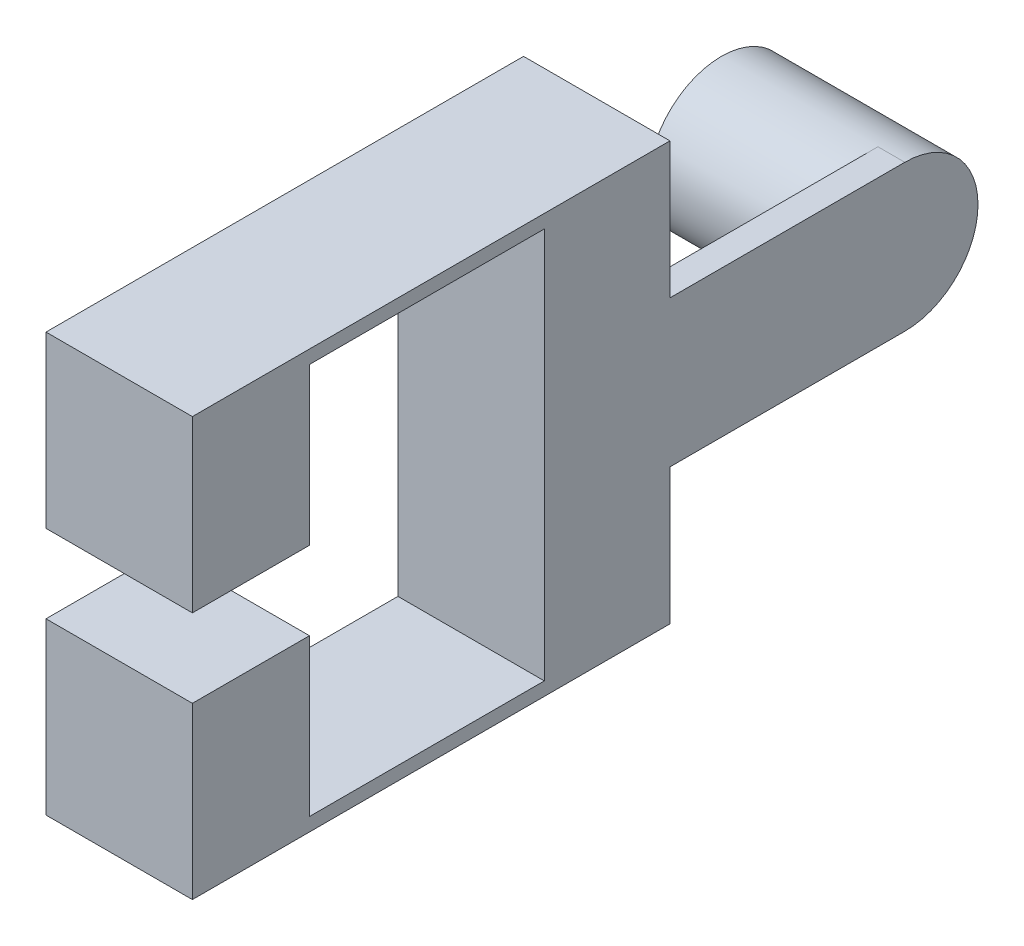
ISO-10303-21;
HEADER;
FILE_DESCRIPTION(('STEP AP214'),'2;1');
FILE_NAME('part.step','',(''),(''),'','','');
FILE_SCHEMA(('AUTOMOTIVE_DESIGN { 1 0 10303 214 1 1 1 1 }'));
ENDSEC;
DATA;
#1=APPLICATION_CONTEXT('core data for automotive mechanical design processes');
#2=APPLICATION_PROTOCOL_DEFINITION('international standard','automotive_design',2000,#1);
#3=PRODUCT_CONTEXT('',#1,'mechanical');
#4=PRODUCT('Part','Part','',(#3));
#5=PRODUCT_RELATED_PRODUCT_CATEGORY('part','',(#4));
#6=PRODUCT_DEFINITION_FORMATION('','',#4);
#7=PRODUCT_DEFINITION_CONTEXT('part definition',#1,'design');
#8=PRODUCT_DEFINITION('design','',#6,#7);
#9=PRODUCT_DEFINITION_SHAPE('','',#8);
#10=(LENGTH_UNIT() NAMED_UNIT(*) SI_UNIT(.MILLI.,.METRE.));
#11=(NAMED_UNIT(*) PLANE_ANGLE_UNIT() SI_UNIT($,.RADIAN.));
#12=(NAMED_UNIT(*) SI_UNIT($,.STERADIAN.) SOLID_ANGLE_UNIT());
#13=UNCERTAINTY_MEASURE_WITH_UNIT(LENGTH_MEASURE(1.E-05),#10,'distance_accuracy_value','');
#14=(GEOMETRIC_REPRESENTATION_CONTEXT(3) GLOBAL_UNCERTAINTY_ASSIGNED_CONTEXT((#13)) GLOBAL_UNIT_ASSIGNED_CONTEXT((#10,
#11,#12)) REPRESENTATION_CONTEXT('',''));
#15=CARTESIAN_POINT('',(0.,0.,0.));
#16=DIRECTION('',(0.,0.,1.));
#17=DIRECTION('',(1.,0.,0.));
#18=AXIS2_PLACEMENT_3D('',#15,#16,#17);
#19=CARTESIAN_POINT('',(25.4,0.,0.));
#20=DIRECTION('',(-1.,0.,0.));
#21=DIRECTION('',(0.,0.,1.));
#22=AXIS2_PLACEMENT_3D('',#19,#20,#21);
#23=CYLINDRICAL_SURFACE('',#22,11.8736401687946);
#24=CARTESIAN_POINT('',(25.4,0.,0.));
#25=DIRECTION('',(1.,0.,0.));
#26=DIRECTION('',(0.,0.,-1.));
#27=AXIS2_PLACEMENT_3D('',#24,#25,#26);
#28=CIRCLE('',#27,11.8736401687946);
#29=CARTESIAN_POINT('',(25.4,11.8736401687946,0.));
#30=VERTEX_POINT('',#29);
#31=CARTESIAN_POINT('',(25.4,-11.8736401687946,0.));
#32=VERTEX_POINT('',#31);
#33=EDGE_CURVE('E11',#30,#32,#28,.T.);
#34=ORIENTED_EDGE('',*,*,#33,.F.);
#35=DIRECTION('',(-1.,0.,0.));
#36=VECTOR('',#35,1.);
#37=CARTESIAN_POINT('',(29.7593720128164,11.8736401687946,0.));
#38=LINE('',#37,#36);
#39=CARTESIAN_POINT('',(29.7593720128164,11.8736401687946,0.));
#40=VERTEX_POINT('',#39);
#41=EDGE_CURVE('E324',#40,#30,#38,.T.);
#42=ORIENTED_EDGE('',*,*,#41,.F.);
#43=CARTESIAN_POINT('',(29.7593720128164,0.,0.));
#44=DIRECTION('',(1.,0.,0.));
#45=DIRECTION('',(0.,0.,1.));
#46=AXIS2_PLACEMENT_3D('',#43,#44,#45);
#47=CIRCLE('',#46,11.8736401687946);
#48=CARTESIAN_POINT('',(29.7593720128164,-11.8736401687946,-1.31617191178365E-06));
#49=VERTEX_POINT('',#48);
#50=EDGE_CURVE('E297',#49,#40,#47,.T.);
#51=ORIENTED_EDGE('',*,*,#50,.F.);
#52=DIRECTION('',(-1.,0.,0.));
#53=VECTOR('',#52,1.);
#54=CARTESIAN_POINT('',(29.7593720128164,-11.8736401687946,-1.31617191178365E-06));
#55=LINE('',#54,#53);
#56=EDGE_CURVE('E305',#49,#32,#55,.T.);
#57=ORIENTED_EDGE('',*,*,#56,.T.);
#58=EDGE_LOOP('',(#34,#42,#51,#57));
#59=FACE_BOUND('',#58,.T.);
#60=CARTESIAN_POINT('',(0.,0.,0.));
#61=DIRECTION('',(1.,0.,0.));
#62=DIRECTION('',(0.,0.,-1.));
#63=AXIS2_PLACEMENT_3D('',#60,#61,#62);
#64=CIRCLE('',#63,11.8736401687946);
#65=CARTESIAN_POINT('',(0.,0.,-11.8736401687946));
#66=VERTEX_POINT('',#65);
#67=EDGE_CURVE('E48',#66,#66,#64,.T.);
#68=ORIENTED_EDGE('',*,*,#67,.T.);
#69=EDGE_LOOP('',(#68));
#70=FACE_BOUND('',#69,.T.);
#71=ADVANCED_FACE('F45',(#59,#70),#23,.T.);
#72=CARTESIAN_POINT('',(0.,0.,0.));
#73=DIRECTION('',(1.,0.,0.));
#74=DIRECTION('',(0.,0.,-1.));
#75=AXIS2_PLACEMENT_3D('',#72,#73,#74);
#76=PLANE('',#75);
#77=ORIENTED_EDGE('',*,*,#67,.F.);
#78=EDGE_LOOP('',(#77));
#79=FACE_BOUND('',#78,.T.);
#80=ADVANCED_FACE('F332',(#79),#76,.F.);
#81=CARTESIAN_POINT('',(29.7593720128164,11.8736401687946,0.));
#82=DIRECTION('',(0.,-1.,0.));
#83=DIRECTION('',(0.,0.,-1.));
#84=AXIS2_PLACEMENT_3D('',#81,#82,#83);
#85=PLANE('',#84);
#86=DIRECTION('',(0.,0.,1.));
#87=VECTOR('',#86,1.);
#88=CARTESIAN_POINT('',(25.4,11.8736401687946,0.));
#89=LINE('',#88,#87);
#90=CARTESIAN_POINT('',(25.4,11.8736401687946,38.0999986838281));
#91=VERTEX_POINT('',#90);
#92=EDGE_CURVE('E291',#30,#91,#89,.T.);
#93=ORIENTED_EDGE('',*,*,#92,.T.);
#94=DIRECTION('',(-1.,0.,0.));
#95=VECTOR('',#94,1.);
#96=CARTESIAN_POINT('',(29.7593720128164,11.8736401687946,38.0999986838281));
#97=LINE('',#96,#95);
#98=CARTESIAN_POINT('',(29.7593720128164,11.8736401687946,38.0999986838281));
#99=VERTEX_POINT('',#98);
#100=EDGE_CURVE('E320',#99,#91,#97,.T.);
#101=ORIENTED_EDGE('',*,*,#100,.F.);
#102=DIRECTION('',(0.,0.,1.));
#103=VECTOR('',#102,1.);
#104=CARTESIAN_POINT('',(29.7593720128164,11.8736401687946,0.));
#105=LINE('',#104,#103);
#106=EDGE_CURVE('E87',#40,#99,#105,.T.);
#107=ORIENTED_EDGE('',*,*,#106,.F.);
#108=ORIENTED_EDGE('',*,*,#41,.T.);
#109=EDGE_LOOP('',(#93,#101,#107,#108));
#110=FACE_BOUND('',#109,.T.);
#111=ADVANCED_FACE('F334',(#110),#85,.F.);
#112=CARTESIAN_POINT('',(29.7593720128164,-11.8736401687946,-1.31617191178365E-06));
#113=DIRECTION('',(0.,1.,0.));
#114=DIRECTION('',(0.,0.,1.));
#115=AXIS2_PLACEMENT_3D('',#112,#113,#114);
#116=PLANE('',#115);
#117=DIRECTION('',(0.,0.,-1.));
#118=VECTOR('',#117,1.);
#119=CARTESIAN_POINT('',(25.4,-11.8736401687946,-1.31617191178365E-06));
#120=LINE('',#119,#118);
#121=CARTESIAN_POINT('',(25.4,-11.8736401687946,38.0999986838281));
#122=VERTEX_POINT('',#121);
#123=EDGE_CURVE('E300',#122,#32,#120,.T.);
#124=ORIENTED_EDGE('',*,*,#123,.T.);
#125=ORIENTED_EDGE('',*,*,#56,.F.);
#126=DIRECTION('',(0.,0.,-1.));
#127=VECTOR('',#126,1.);
#128=CARTESIAN_POINT('',(29.7593720128164,-11.8736401687946,-1.31617191178365E-06));
#129=LINE('',#128,#127);
#130=CARTESIAN_POINT('',(29.7593720128164,-11.8736401687946,38.0999986838281));
#131=VERTEX_POINT('',#130);
#132=EDGE_CURVE('E67',#131,#49,#129,.T.);
#133=ORIENTED_EDGE('',*,*,#132,.F.);
#134=DIRECTION('',(-1.,0.,0.));
#135=VECTOR('',#134,1.);
#136=CARTESIAN_POINT('',(29.7593720128164,-11.8736401687946,38.0999986838281));
#137=LINE('',#136,#135);
#138=EDGE_CURVE('E80',#131,#122,#137,.T.);
#139=ORIENTED_EDGE('',*,*,#138,.T.);
#140=EDGE_LOOP('',(#124,#125,#133,#139));
#141=FACE_BOUND('',#140,.T.);
#142=ADVANCED_FACE('F339',(#141),#116,.F.);
#143=CARTESIAN_POINT('',(29.7593720128164,0.,0.));
#144=DIRECTION('',(-1.,0.,0.));
#145=DIRECTION('',(0.,0.,1.));
#146=AXIS2_PLACEMENT_3D('',#143,#144,#145);
#147=PLANE('',#146);
#148=ORIENTED_EDGE('',*,*,#50,.T.);
#149=ORIENTED_EDGE('',*,*,#106,.T.);
#150=DIRECTION('',(0.,1.,0.));
#151=VECTOR('',#150,1.);
#152=CARTESIAN_POINT('',(29.7593720128164,31.75,38.0999986838281));
#153=LINE('',#152,#151);
#154=CARTESIAN_POINT('',(29.7593720128164,33.9296860064082,38.0999986838281));
#155=VERTEX_POINT('',#154);
#156=EDGE_CURVE('E294',#99,#155,#153,.T.);
#157=ORIENTED_EDGE('',*,*,#156,.T.);
#158=DIRECTION('',(0.,0.,1.));
#159=VECTOR('',#158,1.);
#160=CARTESIAN_POINT('',(29.7593720128164,33.9296860064082,38.0999986838281));
#161=LINE('',#160,#159);
#162=CARTESIAN_POINT('',(29.7593720128164,33.9296860064082,115.569045481264));
#163=VERTEX_POINT('',#162);
#164=EDGE_CURVE('E254',#155,#163,#161,.T.);
#165=ORIENTED_EDGE('',*,*,#164,.T.);
#166=DIRECTION('',(0.,1.,0.));
#167=VECTOR('',#166,1.);
#168=CARTESIAN_POINT('',(29.7593720128164,33.9296860064082,115.569045481264));
#169=LINE('',#168,#167);
#170=CARTESIAN_POINT('',(29.7593720128164,6.34999999999999,115.569045481264));
#171=VERTEX_POINT('',#170);
#172=EDGE_CURVE('E176',#171,#163,#169,.T.);
#173=ORIENTED_EDGE('',*,*,#172,.F.);
#174=DIRECTION('',(0.,0.,-1.));
#175=VECTOR('',#174,1.);
#176=CARTESIAN_POINT('',(29.7593720128164,6.34999999999999,115.569045481264));
#177=LINE('',#176,#175);
#178=CARTESIAN_POINT('',(29.7593720128164,6.34999999999999,96.577196337597));
#179=VERTEX_POINT('',#178);
#180=EDGE_CURVE('E171',#171,#179,#177,.T.);
#181=ORIENTED_EDGE('',*,*,#180,.T.);
#182=DIRECTION('',(0.,1.,0.));
#183=VECTOR('',#182,1.);
#184=CARTESIAN_POINT('',(29.7593720128164,33.9296860064082,96.577196337597));
#185=LINE('',#184,#183);
#186=CARTESIAN_POINT('',(29.7593720128164,31.75,96.577196337597));
#187=VERTEX_POINT('',#186);
#188=EDGE_CURVE('E187',#179,#187,#185,.T.);
#189=ORIENTED_EDGE('',*,*,#188,.T.);
#190=DIRECTION('',(0.,0.,1.));
#191=VECTOR('',#190,1.);
#192=CARTESIAN_POINT('',(29.7593720128164,31.75,38.0999986838281));
#193=LINE('',#192,#191);
#194=CARTESIAN_POINT('',(29.7593720128164,31.75,58.477196337597));
#195=VERTEX_POINT('',#194);
#196=EDGE_CURVE('E246',#195,#187,#193,.T.);
#197=ORIENTED_EDGE('',*,*,#196,.F.);
#198=DIRECTION('',(0.,1.,0.));
#199=VECTOR('',#198,1.);
#200=CARTESIAN_POINT('',(29.7593720128164,31.75,58.477196337597));
#201=LINE('',#200,#199);
#202=CARTESIAN_POINT('',(29.7593720128164,-31.75,58.477196337597));
#203=VERTEX_POINT('',#202);
#204=EDGE_CURVE('E283',#203,#195,#201,.T.);
#205=ORIENTED_EDGE('',*,*,#204,.F.);
#206=DIRECTION('',(0.,0.,1.));
#207=VECTOR('',#206,1.);
#208=CARTESIAN_POINT('',(29.7593720128164,-31.75,38.0999986838281));
#209=LINE('',#208,#207);
#210=CARTESIAN_POINT('',(29.7593720128164,-31.75,96.577196337597));
#211=VERTEX_POINT('',#210);
#212=EDGE_CURVE('E194',#203,#211,#209,.T.);
#213=ORIENTED_EDGE('',*,*,#212,.T.);
#214=DIRECTION('',(0.,1.,0.));
#215=VECTOR('',#214,1.);
#216=CARTESIAN_POINT('',(29.7593720128164,-33.9296860064082,96.577196337597));
#217=LINE('',#216,#215);
#218=CARTESIAN_POINT('',(29.7593720128164,-6.34999999999998,96.577196337597));
#219=VERTEX_POINT('',#218);
#220=EDGE_CURVE('E215',#211,#219,#217,.T.);
#221=ORIENTED_EDGE('',*,*,#220,.T.);
#222=DIRECTION('',(0.,0.,-1.));
#223=VECTOR('',#222,1.);
#224=CARTESIAN_POINT('',(29.7593720128164,-6.34999999999998,115.569045481264));
#225=LINE('',#224,#223);
#226=CARTESIAN_POINT('',(29.7593720128164,-6.34999999999998,115.569045481264));
#227=VERTEX_POINT('',#226);
#228=EDGE_CURVE('E203',#227,#219,#225,.T.);
#229=ORIENTED_EDGE('',*,*,#228,.F.);
#230=DIRECTION('',(0.,1.,0.));
#231=VECTOR('',#230,1.);
#232=CARTESIAN_POINT('',(29.7593720128164,-33.9296860064082,115.569045481264));
#233=LINE('',#232,#231);
#234=CARTESIAN_POINT('',(29.7593720128164,-33.9296860064082,115.569045481264));
#235=VERTEX_POINT('',#234);
#236=EDGE_CURVE('E225',#235,#227,#233,.T.);
#237=ORIENTED_EDGE('',*,*,#236,.F.);
#238=DIRECTION('',(0.,0.,1.));
#239=VECTOR('',#238,1.);
#240=CARTESIAN_POINT('',(29.7593720128164,-33.9296860064082,38.0999986838281));
#241=LINE('',#240,#239);
#242=CARTESIAN_POINT('',(29.7593720128164,-33.9296860064082,38.0999986838281));
#243=VERTEX_POINT('',#242);
#244=EDGE_CURVE('E235',#243,#235,#241,.T.);
#245=ORIENTED_EDGE('',*,*,#244,.F.);
#246=EDGE_CURVE('E279',#243,#131,#153,.T.);
#247=ORIENTED_EDGE('',*,*,#246,.T.);
#248=ORIENTED_EDGE('',*,*,#132,.T.);
#249=EDGE_LOOP('',(#148,#149,#157,#165,#173,#181,#189,#197,#205,#213,#221,#229,#237,#245,#247,#248));
#250=FACE_BOUND('',#249,.T.);
#251=ADVANCED_FACE('F345',(#250),#147,.F.);
#252=CARTESIAN_POINT('',(25.4,0.,0.));
#253=DIRECTION('',(-1.,0.,0.));
#254=DIRECTION('',(0.,0.,1.));
#255=AXIS2_PLACEMENT_3D('',#252,#253,#254);
#256=PLANE('',#255);
#257=ORIENTED_EDGE('',*,*,#92,.F.);
#258=ORIENTED_EDGE('',*,*,#33,.T.);
#259=ORIENTED_EDGE('',*,*,#123,.F.);
#260=DIRECTION('',(0.,-1.,0.));
#261=VECTOR('',#260,1.);
#262=CARTESIAN_POINT('',(25.4,-11.8736401687946,38.0999986838281));
#263=LINE('',#262,#261);
#264=EDGE_CURVE('E309',#91,#122,#263,.T.);
#265=ORIENTED_EDGE('',*,*,#264,.F.);
#266=EDGE_LOOP('',(#257,#258,#259,#265));
#267=FACE_BOUND('',#266,.T.);
#268=ADVANCED_FACE('F346',(#267),#256,.T.);
#269=CARTESIAN_POINT('',(6.01209167522726,31.75,58.477196337597));
#270=DIRECTION('',(1.,0.,0.));
#271=DIRECTION('',(0.,1.,0.));
#272=AXIS2_PLACEMENT_3D('',#269,#270,#271);
#273=PLANE('',#272);
#274=DIRECTION('',(0.,-1.,0.));
#275=VECTOR('',#274,1.);
#276=CARTESIAN_POINT('',(6.01209167522726,31.75,38.0999986838281));
#277=LINE('',#276,#275);
#278=CARTESIAN_POINT('',(6.01209167522726,33.9296860064082,38.0999986838281));
#279=VERTEX_POINT('',#278);
#280=CARTESIAN_POINT('',(6.01209167522727,-33.9296860064082,38.0999986838281));
#281=VERTEX_POINT('',#280);
#282=EDGE_CURVE('E265',#279,#281,#277,.T.);
#283=ORIENTED_EDGE('',*,*,#282,.T.);
#284=DIRECTION('',(0.,0.,-1.));
#285=VECTOR('',#284,1.);
#286=CARTESIAN_POINT('',(6.01209167522727,-33.9296860064082,38.0999986838281));
#287=LINE('',#286,#285);
#288=CARTESIAN_POINT('',(6.01209167522727,-33.9296860064082,115.569045481264));
#289=VERTEX_POINT('',#288);
#290=EDGE_CURVE('E238',#289,#281,#287,.T.);
#291=ORIENTED_EDGE('',*,*,#290,.F.);
#292=DIRECTION('',(0.,-1.,0.));
#293=VECTOR('',#292,1.);
#294=CARTESIAN_POINT('',(6.01209167522727,-33.9296860064082,115.569045481264));
#295=LINE('',#294,#293);
#296=CARTESIAN_POINT('',(6.01209167522726,-6.34999999999998,115.569045481264));
#297=VERTEX_POINT('',#296);
#298=EDGE_CURVE('E216',#297,#289,#295,.T.);
#299=ORIENTED_EDGE('',*,*,#298,.F.);
#300=DIRECTION('',(0.,0.,-1.));
#301=VECTOR('',#300,1.);
#302=CARTESIAN_POINT('',(6.01209167522726,-6.34999999999998,115.569045481264));
#303=LINE('',#302,#301);
#304=CARTESIAN_POINT('',(6.01209167522726,-6.34999999999998,96.577196337597));
#305=VERTEX_POINT('',#304);
#306=EDGE_CURVE('E207',#297,#305,#303,.T.);
#307=ORIENTED_EDGE('',*,*,#306,.T.);
#308=DIRECTION('',(0.,-1.,0.));
#309=VECTOR('',#308,1.);
#310=CARTESIAN_POINT('',(6.01209167522727,-33.9296860064082,96.577196337597));
#311=LINE('',#310,#309);
#312=CARTESIAN_POINT('',(6.01209167522727,-31.75,96.577196337597));
#313=VERTEX_POINT('',#312);
#314=EDGE_CURVE('E219',#305,#313,#311,.T.);
#315=ORIENTED_EDGE('',*,*,#314,.T.);
#316=DIRECTION('',(0.,0.,-1.));
#317=VECTOR('',#316,1.);
#318=CARTESIAN_POINT('',(6.01209167522727,-31.75,38.0999986838281));
#319=LINE('',#318,#317);
#320=CARTESIAN_POINT('',(6.01209167522727,-31.75,58.477196337597));
#321=VERTEX_POINT('',#320);
#322=EDGE_CURVE('E239',#313,#321,#319,.T.);
#323=ORIENTED_EDGE('',*,*,#322,.T.);
#324=DIRECTION('',(0.,-1.,0.));
#325=VECTOR('',#324,1.);
#326=CARTESIAN_POINT('',(6.01209167522726,31.75,58.477196337597));
#327=LINE('',#326,#325);
#328=CARTESIAN_POINT('',(6.01209167522726,31.75,58.477196337597));
#329=VERTEX_POINT('',#328);
#330=EDGE_CURVE('E274',#329,#321,#327,.T.);
#331=ORIENTED_EDGE('',*,*,#330,.F.);
#332=DIRECTION('',(0.,0.,1.));
#333=VECTOR('',#332,1.);
#334=CARTESIAN_POINT('',(6.01209167522726,31.75,38.0999986838281));
#335=LINE('',#334,#333);
#336=CARTESIAN_POINT('',(6.01209167522726,31.75,96.577196337597));
#337=VERTEX_POINT('',#336);
#338=EDGE_CURVE('E258',#329,#337,#335,.T.);
#339=ORIENTED_EDGE('',*,*,#338,.T.);
#340=DIRECTION('',(0.,-1.,0.));
#341=VECTOR('',#340,1.);
#342=CARTESIAN_POINT('',(6.01209167522726,33.9296860064082,96.577196337597));
#343=LINE('',#342,#341);
#344=CARTESIAN_POINT('',(6.01209167522726,6.34999999999999,96.577196337597));
#345=VERTEX_POINT('',#344);
#346=EDGE_CURVE('E191',#337,#345,#343,.T.);
#347=ORIENTED_EDGE('',*,*,#346,.T.);
#348=DIRECTION('',(0.,0.,-1.));
#349=VECTOR('',#348,1.);
#350=CARTESIAN_POINT('',(6.01209167522726,6.34999999999999,115.569045481264));
#351=LINE('',#350,#349);
#352=CARTESIAN_POINT('',(6.01209167522726,6.34999999999999,115.569045481264));
#353=VERTEX_POINT('',#352);
#354=EDGE_CURVE('E169',#353,#345,#351,.T.);
#355=ORIENTED_EDGE('',*,*,#354,.F.);
#356=DIRECTION('',(0.,-1.,0.));
#357=VECTOR('',#356,1.);
#358=CARTESIAN_POINT('',(6.01209167522726,33.9296860064082,115.569045481264));
#359=LINE('',#358,#357);
#360=CARTESIAN_POINT('',(6.01209167522726,33.9296860064082,115.569045481264));
#361=VERTEX_POINT('',#360);
#362=EDGE_CURVE('E177',#361,#353,#359,.T.);
#363=ORIENTED_EDGE('',*,*,#362,.F.);
#364=DIRECTION('',(0.,0.,1.));
#365=VECTOR('',#364,1.);
#366=CARTESIAN_POINT('',(6.01209167522726,33.9296860064082,38.0999986838281));
#367=LINE('',#366,#365);
#368=EDGE_CURVE('E257',#279,#361,#367,.T.);
#369=ORIENTED_EDGE('',*,*,#368,.F.);
#370=EDGE_LOOP('',(#283,#291,#299,#307,#315,#323,#331,#339,#347,#355,#363,#369));
#371=FACE_BOUND('',#370,.T.);
#372=ADVANCED_FACE('F189',(#371),#273,.F.);
#373=CARTESIAN_POINT('',(0.,0.,58.477196337597));
#374=DIRECTION('',(0.,0.,1.));
#375=DIRECTION('',(1.,0.,0.));
#376=AXIS2_PLACEMENT_3D('',#373,#374,#375);
#377=PLANE('',#376);
#378=ORIENTED_EDGE('',*,*,#330,.T.);
#379=DIRECTION('',(1.,0.,0.));
#380=VECTOR('',#379,1.);
#381=CARTESIAN_POINT('',(6.01209167522727,-31.75,58.477196337597));
#382=LINE('',#381,#380);
#383=EDGE_CURVE('E278',#321,#203,#382,.T.);
#384=ORIENTED_EDGE('',*,*,#383,.T.);
#385=ORIENTED_EDGE('',*,*,#204,.T.);
#386=DIRECTION('',(-1.,0.,0.));
#387=VECTOR('',#386,1.);
#388=CARTESIAN_POINT('',(6.01209167522726,31.75,58.477196337597));
#389=LINE('',#388,#387);
#390=EDGE_CURVE('E287',#195,#329,#389,.T.);
#391=ORIENTED_EDGE('',*,*,#390,.T.);
#392=EDGE_LOOP('',(#378,#384,#385,#391));
#393=FACE_BOUND('',#392,.T.);
#394=ADVANCED_FACE('F353',(#393),#377,.T.);
#395=CARTESIAN_POINT('',(0.,0.,38.0999986838281));
#396=DIRECTION('',(0.,0.,1.));
#397=DIRECTION('',(1.,0.,0.));
#398=AXIS2_PLACEMENT_3D('',#395,#396,#397);
#399=PLANE('',#398);
#400=ORIENTED_EDGE('',*,*,#138,.F.);
#401=ORIENTED_EDGE('',*,*,#246,.F.);
#402=DIRECTION('',(1.,0.,0.));
#403=VECTOR('',#402,1.);
#404=CARTESIAN_POINT('',(29.7593720128164,-33.9296860064082,38.0999986838281));
#405=LINE('',#404,#403);
#406=EDGE_CURVE('E243',#281,#243,#405,.T.);
#407=ORIENTED_EDGE('',*,*,#406,.F.);
#408=ORIENTED_EDGE('',*,*,#282,.F.);
#409=DIRECTION('',(-1.,0.,0.));
#410=VECTOR('',#409,1.);
#411=CARTESIAN_POINT('',(29.7593720128164,33.9296860064082,38.0999986838281));
#412=LINE('',#411,#410);
#413=EDGE_CURVE('E261',#155,#279,#412,.T.);
#414=ORIENTED_EDGE('',*,*,#413,.F.);
#415=ORIENTED_EDGE('',*,*,#156,.F.);
#416=ORIENTED_EDGE('',*,*,#100,.T.);
#417=ORIENTED_EDGE('',*,*,#264,.T.);
#418=EDGE_LOOP('',(#400,#401,#407,#408,#414,#415,#416,#417));
#419=FACE_BOUND('',#418,.T.);
#420=ADVANCED_FACE('F354',(#419),#399,.F.);
#421=CARTESIAN_POINT('',(0.,31.75,0.));
#422=DIRECTION('',(0.,-1.,0.));
#423=DIRECTION('',(1.,0.,0.));
#424=AXIS2_PLACEMENT_3D('',#421,#422,#423);
#425=PLANE('',#424);
#426=ORIENTED_EDGE('',*,*,#390,.F.);
#427=ORIENTED_EDGE('',*,*,#196,.T.);
#428=DIRECTION('',(-1.,0.,0.));
#429=VECTOR('',#428,1.);
#430=CARTESIAN_POINT('',(29.7593720128164,31.75,96.577196337597));
#431=LINE('',#430,#429);
#432=EDGE_CURVE('E268',#187,#337,#431,.T.);
#433=ORIENTED_EDGE('',*,*,#432,.T.);
#434=ORIENTED_EDGE('',*,*,#338,.F.);
#435=EDGE_LOOP('',(#426,#427,#433,#434));
#436=FACE_BOUND('',#435,.T.);
#437=ADVANCED_FACE('F357',(#436),#425,.T.);
#438=CARTESIAN_POINT('',(0.,33.9296860064082,0.));
#439=DIRECTION('',(0.,-1.,0.));
#440=DIRECTION('',(1.,0.,0.));
#441=AXIS2_PLACEMENT_3D('',#438,#439,#440);
#442=PLANE('',#441);
#443=ORIENTED_EDGE('',*,*,#164,.F.);
#444=ORIENTED_EDGE('',*,*,#413,.T.);
#445=ORIENTED_EDGE('',*,*,#368,.T.);
#446=DIRECTION('',(-1.,0.,0.));
#447=VECTOR('',#446,1.);
#448=CARTESIAN_POINT('',(6.01209167522726,33.9296860064082,115.569045481264));
#449=LINE('',#448,#447);
#450=EDGE_CURVE('E183',#163,#361,#449,.T.);
#451=ORIENTED_EDGE('',*,*,#450,.F.);
#452=EDGE_LOOP('',(#443,#444,#445,#451));
#453=FACE_BOUND('',#452,.T.);
#454=ADVANCED_FACE('F364',(#453),#442,.F.);
#455=CARTESIAN_POINT('',(0.,-33.9296860064082,0.));
#456=DIRECTION('',(0.,-1.,0.));
#457=DIRECTION('',(1.,0.,0.));
#458=AXIS2_PLACEMENT_3D('',#455,#456,#457);
#459=PLANE('',#458);
#460=ORIENTED_EDGE('',*,*,#244,.T.);
#461=DIRECTION('',(1.,0.,0.));
#462=VECTOR('',#461,1.);
#463=CARTESIAN_POINT('',(6.01209167522727,-33.9296860064082,115.569045481264));
#464=LINE('',#463,#462);
#465=EDGE_CURVE('E228',#289,#235,#464,.T.);
#466=ORIENTED_EDGE('',*,*,#465,.F.);
#467=ORIENTED_EDGE('',*,*,#290,.T.);
#468=ORIENTED_EDGE('',*,*,#406,.T.);
#469=EDGE_LOOP('',(#460,#466,#467,#468));
#470=FACE_BOUND('',#469,.T.);
#471=ADVANCED_FACE('F368',(#470),#459,.T.);
#472=CARTESIAN_POINT('',(0.,-31.75,0.));
#473=DIRECTION('',(0.,-1.,0.));
#474=DIRECTION('',(1.,0.,0.));
#475=AXIS2_PLACEMENT_3D('',#472,#473,#474);
#476=PLANE('',#475);
#477=ORIENTED_EDGE('',*,*,#383,.F.);
#478=ORIENTED_EDGE('',*,*,#322,.F.);
#479=DIRECTION('',(-1.,0.,0.));
#480=VECTOR('',#479,1.);
#481=CARTESIAN_POINT('',(29.7593720128164,-31.75,96.577196337597));
#482=LINE('',#481,#480);
#483=EDGE_CURVE('E198',#211,#313,#482,.T.);
#484=ORIENTED_EDGE('',*,*,#483,.F.);
#485=ORIENTED_EDGE('',*,*,#212,.F.);
#486=EDGE_LOOP('',(#477,#478,#484,#485));
#487=FACE_BOUND('',#486,.T.);
#488=ADVANCED_FACE('F370',(#487),#476,.F.);
#489=CARTESIAN_POINT('',(0.,0.,96.577196337597));
#490=DIRECTION('',(0.,0.,-1.));
#491=DIRECTION('',(-1.,0.,0.));
#492=AXIS2_PLACEMENT_3D('',#489,#490,#491);
#493=PLANE('',#492);
#494=ORIENTED_EDGE('',*,*,#483,.T.);
#495=ORIENTED_EDGE('',*,*,#314,.F.);
#496=DIRECTION('',(-1.,0.,0.));
#497=VECTOR('',#496,1.);
#498=CARTESIAN_POINT('',(6.01209167522726,-6.34999999999998,96.577196337597));
#499=LINE('',#498,#497);
#500=EDGE_CURVE('E212',#219,#305,#499,.T.);
#501=ORIENTED_EDGE('',*,*,#500,.F.);
#502=ORIENTED_EDGE('',*,*,#220,.F.);
#503=EDGE_LOOP('',(#494,#495,#501,#502));
#504=FACE_BOUND('',#503,.T.);
#505=ADVANCED_FACE('F373',(#504),#493,.T.);
#506=CARTESIAN_POINT('',(6.01209167522726,-6.34999999999998,115.569045481264));
#507=DIRECTION('',(0.,-1.,0.));
#508=DIRECTION('',(0.,0.,-1.));
#509=AXIS2_PLACEMENT_3D('',#506,#507,#508);
#510=PLANE('',#509);
#511=ORIENTED_EDGE('',*,*,#500,.T.);
#512=ORIENTED_EDGE('',*,*,#306,.F.);
#513=DIRECTION('',(-1.,0.,0.));
#514=VECTOR('',#513,1.);
#515=CARTESIAN_POINT('',(6.01209167522726,-6.34999999999998,115.569045481264));
#516=LINE('',#515,#514);
#517=EDGE_CURVE('E211',#227,#297,#516,.T.);
#518=ORIENTED_EDGE('',*,*,#517,.F.);
#519=ORIENTED_EDGE('',*,*,#228,.T.);
#520=EDGE_LOOP('',(#511,#512,#518,#519));
#521=FACE_BOUND('',#520,.T.);
#522=ADVANCED_FACE('F381',(#521),#510,.F.);
#523=CARTESIAN_POINT('',(0.,0.,115.569045481264));
#524=DIRECTION('',(0.,0.,-1.));
#525=DIRECTION('',(-1.,0.,0.));
#526=AXIS2_PLACEMENT_3D('',#523,#524,#525);
#527=PLANE('',#526);
#528=ORIENTED_EDGE('',*,*,#298,.T.);
#529=ORIENTED_EDGE('',*,*,#465,.T.);
#530=ORIENTED_EDGE('',*,*,#236,.T.);
#531=ORIENTED_EDGE('',*,*,#517,.T.);
#532=EDGE_LOOP('',(#528,#529,#530,#531));
#533=FACE_BOUND('',#532,.T.);
#534=ADVANCED_FACE('F378',(#533),#527,.F.);
#535=CARTESIAN_POINT('',(6.01209167522726,6.34999999999999,115.569045481264));
#536=DIRECTION('',(0.,1.,0.));
#537=DIRECTION('',(0.,0.,1.));
#538=AXIS2_PLACEMENT_3D('',#535,#536,#537);
#539=PLANE('',#538);
#540=DIRECTION('',(1.,0.,0.));
#541=VECTOR('',#540,1.);
#542=CARTESIAN_POINT('',(6.01209167522726,6.34999999999999,96.577196337597));
#543=LINE('',#542,#541);
#544=EDGE_CURVE('E556',#345,#179,#543,.T.);
#545=ORIENTED_EDGE('',*,*,#544,.T.);
#546=ORIENTED_EDGE('',*,*,#180,.F.);
#547=DIRECTION('',(1.,0.,0.));
#548=VECTOR('',#547,1.);
#549=CARTESIAN_POINT('',(6.01209167522726,6.34999999999999,115.569045481264));
#550=LINE('',#549,#548);
#551=EDGE_CURVE('E165',#353,#171,#550,.T.);
#552=ORIENTED_EDGE('',*,*,#551,.F.);
#553=ORIENTED_EDGE('',*,*,#354,.T.);
#554=EDGE_LOOP('',(#545,#546,#552,#553));
#555=FACE_BOUND('',#554,.T.);
#556=ADVANCED_FACE('F167',(#555),#539,.F.);
#557=CARTESIAN_POINT('',(0.,0.,115.569045481264));
#558=DIRECTION('',(0.,0.,1.));
#559=DIRECTION('',(1.,0.,0.));
#560=AXIS2_PLACEMENT_3D('',#557,#558,#559);
#561=PLANE('',#560);
#562=ORIENTED_EDGE('',*,*,#362,.T.);
#563=ORIENTED_EDGE('',*,*,#551,.T.);
#564=ORIENTED_EDGE('',*,*,#172,.T.);
#565=ORIENTED_EDGE('',*,*,#450,.T.);
#566=EDGE_LOOP('',(#562,#563,#564,#565));
#567=FACE_BOUND('',#566,.T.);
#568=ADVANCED_FACE('F181',(#567),#561,.T.);
#569=CARTESIAN_POINT('',(0.,0.,96.577196337597));
#570=DIRECTION('',(0.,0.,1.));
#571=DIRECTION('',(1.,0.,0.));
#572=AXIS2_PLACEMENT_3D('',#569,#570,#571);
#573=PLANE('',#572);
#574=ORIENTED_EDGE('',*,*,#432,.F.);
#575=ORIENTED_EDGE('',*,*,#188,.F.);
#576=ORIENTED_EDGE('',*,*,#544,.F.);
#577=ORIENTED_EDGE('',*,*,#346,.F.);
#578=EDGE_LOOP('',(#574,#575,#576,#577));
#579=FACE_BOUND('',#578,.T.);
#580=ADVANCED_FACE('F391',(#579),#573,.F.);
#581=CLOSED_SHELL('',(#71,#80,#111,#142,#251,#268,#372,#394,#420,#437,#454,#471,#488,#505,#522,
#534,#556,#568,#580));
#582=MANIFOLD_SOLID_BREP('B2',#581);
#583=ADVANCED_BREP_SHAPE_REPRESENTATION('',(#18,#582),#14);
#584=SHAPE_DEFINITION_REPRESENTATION(#9,#583);
ENDSEC;
END-ISO-10303-21;
